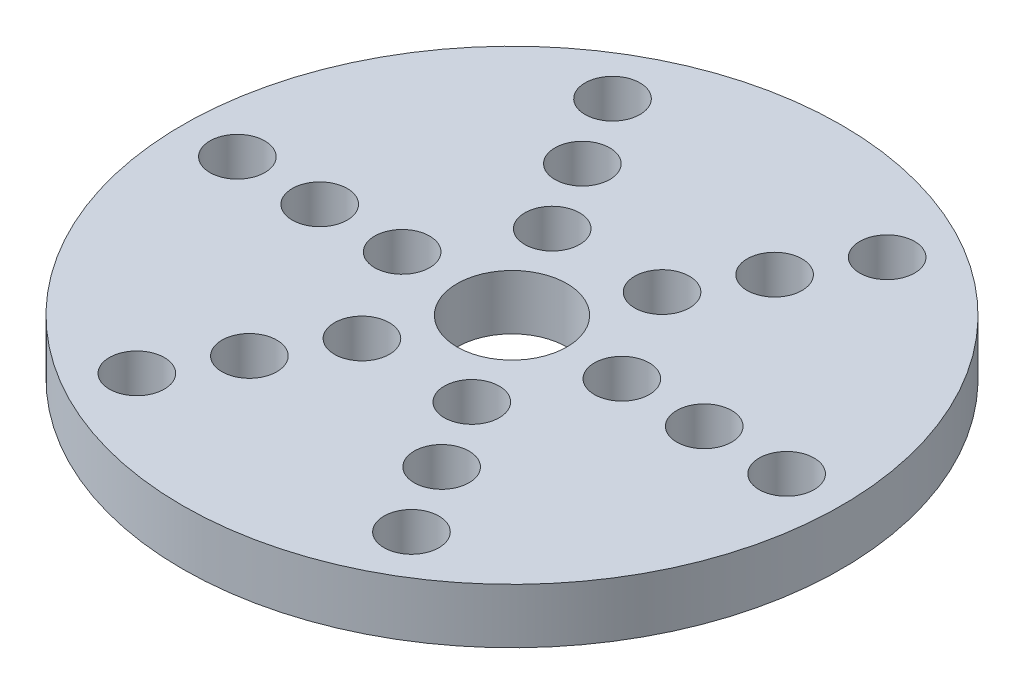
ISO-10303-21;
HEADER;
FILE_DESCRIPTION(('STEP AP214'),'2;1');
FILE_NAME('part.step','',(''),(''),'','','');
FILE_SCHEMA(('AUTOMOTIVE_DESIGN { 1 0 10303 214 1 1 1 1 }'));
ENDSEC;
DATA;
#1=APPLICATION_CONTEXT('core data for automotive mechanical design processes');
#2=APPLICATION_PROTOCOL_DEFINITION('international standard','automotive_design',2000,#1);
#3=PRODUCT_CONTEXT('',#1,'mechanical');
#4=PRODUCT('Part','Part','',(#3));
#5=PRODUCT_RELATED_PRODUCT_CATEGORY('part','',(#4));
#6=PRODUCT_DEFINITION_FORMATION('','',#4);
#7=PRODUCT_DEFINITION_CONTEXT('part definition',#1,'design');
#8=PRODUCT_DEFINITION('design','',#6,#7);
#9=PRODUCT_DEFINITION_SHAPE('','',#8);
#10=(LENGTH_UNIT() NAMED_UNIT(*) SI_UNIT(.MILLI.,.METRE.));
#11=(NAMED_UNIT(*) PLANE_ANGLE_UNIT() SI_UNIT($,.RADIAN.));
#12=(NAMED_UNIT(*) SI_UNIT($,.STERADIAN.) SOLID_ANGLE_UNIT());
#13=UNCERTAINTY_MEASURE_WITH_UNIT(LENGTH_MEASURE(1.E-05),#10,'distance_accuracy_value','');
#14=(GEOMETRIC_REPRESENTATION_CONTEXT(3) GLOBAL_UNCERTAINTY_ASSIGNED_CONTEXT((#13)) GLOBAL_UNIT_ASSIGNED_CONTEXT((#10,
#11,#12)) REPRESENTATION_CONTEXT('',''));
#15=CARTESIAN_POINT('',(0.,0.,0.));
#16=DIRECTION('',(0.,0.,1.));
#17=DIRECTION('',(1.,0.,0.));
#18=AXIS2_PLACEMENT_3D('',#15,#16,#17);
#19=CARTESIAN_POINT('',(0.,10.,0.));
#20=DIRECTION('',(0.,1.,0.));
#21=DIRECTION('',(0.,0.,1.));
#22=AXIS2_PLACEMENT_3D('',#19,#20,#21);
#23=PLANE('',#22);
#24=CARTESIAN_POINT('',(24.9999999999996,10.,43.3012701892222));
#25=DIRECTION('',(0.,1.,0.));
#26=DIRECTION('',(0.,0.,1.));
#27=AXIS2_PLACEMENT_3D('',#24,#25,#26);
#28=CIRCLE('',#27,5.);
#29=CARTESIAN_POINT('',(24.9999999999996,10.,48.3012701892222));
#30=VERTEX_POINT('',#29);
#31=EDGE_CURVE('E184',#30,#30,#28,.T.);
#32=ORIENTED_EDGE('',*,*,#31,.F.);
#33=EDGE_LOOP('',(#32));
#34=FACE_BOUND('',#33,.T.);
#35=CARTESIAN_POINT('',(25.0000000000002,10.,-43.3012701892218));
#36=DIRECTION('',(0.,1.,0.));
#37=DIRECTION('',(0.,0.,1.));
#38=AXIS2_PLACEMENT_3D('',#35,#36,#37);
#39=CIRCLE('',#38,5.);
#40=CARTESIAN_POINT('',(25.0000000000002,10.,-38.3012701892218));
#41=VERTEX_POINT('',#40);
#42=EDGE_CURVE('E168',#41,#41,#39,.T.);
#43=ORIENTED_EDGE('',*,*,#42,.F.);
#44=EDGE_LOOP('',(#43));
#45=FACE_BOUND('',#44,.T.);
#46=CARTESIAN_POINT('',(-17.5000000000004,10.,30.3108891324552));
#47=DIRECTION('',(0.,1.,0.));
#48=DIRECTION('',(0.,0.,1.));
#49=AXIS2_PLACEMENT_3D('',#46,#47,#48);
#50=CIRCLE('',#49,5.);
#51=CARTESIAN_POINT('',(-17.5000000000004,10.,35.3108891324552));
#52=VERTEX_POINT('',#51);
#53=EDGE_CURVE('E152',#52,#52,#50,.T.);
#54=ORIENTED_EDGE('',*,*,#53,.F.);
#55=EDGE_LOOP('',(#54));
#56=FACE_BOUND('',#55,.T.);
#57=CARTESIAN_POINT('',(35.,10.,2.44403693719019E-13));
#58=DIRECTION('',(0.,1.,0.));
#59=DIRECTION('',(0.,0.,1.));
#60=AXIS2_PLACEMENT_3D('',#57,#58,#59);
#61=CIRCLE('',#60,5.);
#62=CARTESIAN_POINT('',(35.,10.,5.00000000000025));
#63=VERTEX_POINT('',#62);
#64=EDGE_CURVE('E136',#63,#63,#61,.T.);
#65=ORIENTED_EDGE('',*,*,#64,.F.);
#66=EDGE_LOOP('',(#65));
#67=FACE_BOUND('',#66,.T.);
#68=CARTESIAN_POINT('',(-17.4999999999999,10.,-30.3108891324554));
#69=DIRECTION('',(0.,1.,0.));
#70=DIRECTION('',(0.,0.,1.));
#71=AXIS2_PLACEMENT_3D('',#68,#69,#70);
#72=CIRCLE('',#71,5.);
#73=CARTESIAN_POINT('',(-17.4999999999999,10.,-25.3108891324554));
#74=VERTEX_POINT('',#73);
#75=EDGE_CURVE('E120',#74,#74,#72,.T.);
#76=ORIENTED_EDGE('',*,*,#75,.F.);
#77=EDGE_LOOP('',(#76));
#78=FACE_BOUND('',#77,.T.);
#79=CARTESIAN_POINT('',(9.99999999999984,10.,17.3205080756889));
#80=DIRECTION('',(0.,1.,0.));
#81=DIRECTION('',(0.,0.,1.));
#82=AXIS2_PLACEMENT_3D('',#79,#80,#81);
#83=CIRCLE('',#82,5.);
#84=CARTESIAN_POINT('',(9.99999999999984,10.,22.3205080756889));
#85=VERTEX_POINT('',#84);
#86=EDGE_CURVE('E104',#85,#85,#83,.T.);
#87=ORIENTED_EDGE('',*,*,#86,.F.);
#88=EDGE_LOOP('',(#87));
#89=FACE_BOUND('',#88,.T.);
#90=CARTESIAN_POINT('',(10.0000000000001,10.,-17.3205080756887));
#91=DIRECTION('',(0.,1.,0.));
#92=DIRECTION('',(0.,0.,1.));
#93=AXIS2_PLACEMENT_3D('',#90,#91,#92);
#94=CIRCLE('',#93,5.);
#95=CARTESIAN_POINT('',(10.0000000000001,10.,-12.3205080756887));
#96=VERTEX_POINT('',#95);
#97=EDGE_CURVE('E88',#96,#96,#94,.T.);
#98=ORIENTED_EDGE('',*,*,#97,.F.);
#99=EDGE_LOOP('',(#98));
#100=FACE_BOUND('',#99,.T.);
#101=CARTESIAN_POINT('',(-50.,10.,0.));
#102=DIRECTION('',(0.,1.,0.));
#103=DIRECTION('',(0.,0.,1.));
#104=AXIS2_PLACEMENT_3D('',#101,#102,#103);
#105=CIRCLE('',#104,5.);
#106=CARTESIAN_POINT('',(-50.,10.,5.));
#107=VERTEX_POINT('',#106);
#108=EDGE_CURVE('E72',#107,#107,#105,.T.);
#109=ORIENTED_EDGE('',*,*,#108,.F.);
#110=EDGE_LOOP('',(#109));
#111=FACE_BOUND('',#110,.T.);
#112=CARTESIAN_POINT('',(-20.,10.,0.));
#113=DIRECTION('',(0.,1.,0.));
#114=DIRECTION('',(0.,0.,1.));
#115=AXIS2_PLACEMENT_3D('',#112,#113,#114);
#116=CIRCLE('',#115,5.);
#117=CARTESIAN_POINT('',(-20.,10.,5.));
#118=VERTEX_POINT('',#117);
#119=EDGE_CURVE('E56',#118,#118,#116,.T.);
#120=ORIENTED_EDGE('',*,*,#119,.F.);
#121=EDGE_LOOP('',(#120));
#122=FACE_BOUND('',#121,.T.);
#123=CARTESIAN_POINT('',(0.,10.,0.));
#124=DIRECTION('',(0.,1.,0.));
#125=DIRECTION('',(0.,0.,1.));
#126=AXIS2_PLACEMENT_3D('',#123,#124,#125);
#127=CIRCLE('',#126,60.);
#128=CARTESIAN_POINT('',(0.,10.,60.));
#129=VERTEX_POINT('',#128);
#130=EDGE_CURVE('E10',#129,#129,#127,.T.);
#131=ORIENTED_EDGE('',*,*,#130,.T.);
#132=EDGE_LOOP('',(#131));
#133=FACE_BOUND('',#132,.T.);
#134=CARTESIAN_POINT('',(0.,10.,0.));
#135=DIRECTION('',(0.,1.,0.));
#136=DIRECTION('',(0.,0.,1.));
#137=AXIS2_PLACEMENT_3D('',#134,#135,#136);
#138=CIRCLE('',#137,10.);
#139=CARTESIAN_POINT('',(0.,10.,10.));
#140=VERTEX_POINT('',#139);
#141=EDGE_CURVE('E50',#140,#140,#138,.T.);
#142=ORIENTED_EDGE('',*,*,#141,.F.);
#143=EDGE_LOOP('',(#142));
#144=FACE_BOUND('',#143,.T.);
#145=CARTESIAN_POINT('',(-35.,10.,0.));
#146=DIRECTION('',(0.,1.,0.));
#147=DIRECTION('',(0.,0.,1.));
#148=AXIS2_PLACEMENT_3D('',#145,#146,#147);
#149=CIRCLE('',#148,5.);
#150=CARTESIAN_POINT('',(-35.,10.,5.));
#151=VERTEX_POINT('',#150);
#152=EDGE_CURVE('E64',#151,#151,#149,.T.);
#153=ORIENTED_EDGE('',*,*,#152,.F.);
#154=EDGE_LOOP('',(#153));
#155=FACE_BOUND('',#154,.T.);
#156=CARTESIAN_POINT('',(-9.99999999999996,10.,-17.3205080756888));
#157=DIRECTION('',(0.,1.,0.));
#158=DIRECTION('',(0.,0.,1.));
#159=AXIS2_PLACEMENT_3D('',#156,#157,#158);
#160=CIRCLE('',#159,5.);
#161=CARTESIAN_POINT('',(-9.99999999999996,10.,-12.3205080756888));
#162=VERTEX_POINT('',#161);
#163=EDGE_CURVE('E80',#162,#162,#160,.T.);
#164=ORIENTED_EDGE('',*,*,#163,.F.);
#165=EDGE_LOOP('',(#164));
#166=FACE_BOUND('',#165,.T.);
#167=CARTESIAN_POINT('',(20.,10.,1.39659253553725E-13));
#168=DIRECTION('',(0.,1.,0.));
#169=DIRECTION('',(0.,0.,1.));
#170=AXIS2_PLACEMENT_3D('',#167,#168,#169);
#171=CIRCLE('',#170,5.);
#172=CARTESIAN_POINT('',(20.,10.,5.00000000000014));
#173=VERTEX_POINT('',#172);
#174=EDGE_CURVE('E96',#173,#173,#171,.T.);
#175=ORIENTED_EDGE('',*,*,#174,.F.);
#176=EDGE_LOOP('',(#175));
#177=FACE_BOUND('',#176,.T.);
#178=CARTESIAN_POINT('',(-10.0000000000002,10.,17.3205080756887));
#179=DIRECTION('',(0.,1.,0.));
#180=DIRECTION('',(0.,0.,1.));
#181=AXIS2_PLACEMENT_3D('',#178,#179,#180);
#182=CIRCLE('',#181,5.);
#183=CARTESIAN_POINT('',(-10.0000000000002,10.,22.3205080756887));
#184=VERTEX_POINT('',#183);
#185=EDGE_CURVE('E112',#184,#184,#182,.T.);
#186=ORIENTED_EDGE('',*,*,#185,.F.);
#187=EDGE_LOOP('',(#186));
#188=FACE_BOUND('',#187,.T.);
#189=CARTESIAN_POINT('',(17.5000000000001,10.,-30.3108891324553));
#190=DIRECTION('',(0.,1.,0.));
#191=DIRECTION('',(0.,0.,1.));
#192=AXIS2_PLACEMENT_3D('',#189,#190,#191);
#193=CIRCLE('',#192,5.);
#194=CARTESIAN_POINT('',(17.5000000000001,10.,-25.3108891324553));
#195=VERTEX_POINT('',#194);
#196=EDGE_CURVE('E128',#195,#195,#193,.T.);
#197=ORIENTED_EDGE('',*,*,#196,.F.);
#198=EDGE_LOOP('',(#197));
#199=FACE_BOUND('',#198,.T.);
#200=CARTESIAN_POINT('',(17.4999999999997,10.,30.3108891324555));
#201=DIRECTION('',(0.,1.,0.));
#202=DIRECTION('',(0.,0.,1.));
#203=AXIS2_PLACEMENT_3D('',#200,#201,#202);
#204=CIRCLE('',#203,5.);
#205=CARTESIAN_POINT('',(17.4999999999997,10.,35.3108891324555));
#206=VERTEX_POINT('',#205);
#207=EDGE_CURVE('E144',#206,#206,#204,.T.);
#208=ORIENTED_EDGE('',*,*,#207,.F.);
#209=EDGE_LOOP('',(#208));
#210=FACE_BOUND('',#209,.T.);
#211=CARTESIAN_POINT('',(-24.9999999999999,10.,-43.301270189222));
#212=DIRECTION('',(0.,1.,0.));
#213=DIRECTION('',(0.,0.,1.));
#214=AXIS2_PLACEMENT_3D('',#211,#212,#213);
#215=CIRCLE('',#214,5.);
#216=CARTESIAN_POINT('',(-24.9999999999999,10.,-38.301270189222));
#217=VERTEX_POINT('',#216);
#218=EDGE_CURVE('E160',#217,#217,#215,.T.);
#219=ORIENTED_EDGE('',*,*,#218,.F.);
#220=EDGE_LOOP('',(#219));
#221=FACE_BOUND('',#220,.T.);
#222=CARTESIAN_POINT('',(50.,10.,3.49148133884313E-13));
#223=DIRECTION('',(0.,1.,0.));
#224=DIRECTION('',(0.,0.,1.));
#225=AXIS2_PLACEMENT_3D('',#222,#223,#224);
#226=CIRCLE('',#225,4.99999999999999);
#227=CARTESIAN_POINT('',(50.,10.,5.00000000000034));
#228=VERTEX_POINT('',#227);
#229=EDGE_CURVE('E176',#228,#228,#226,.T.);
#230=ORIENTED_EDGE('',*,*,#229,.F.);
#231=EDGE_LOOP('',(#230));
#232=FACE_BOUND('',#231,.T.);
#233=CARTESIAN_POINT('',(-25.0000000000005,10.,43.3012701892216));
#234=DIRECTION('',(0.,1.,0.));
#235=DIRECTION('',(0.,0.,1.));
#236=AXIS2_PLACEMENT_3D('',#233,#234,#235);
#237=CIRCLE('',#236,5.);
#238=CARTESIAN_POINT('',(-25.0000000000005,10.,48.3012701892216));
#239=VERTEX_POINT('',#238);
#240=EDGE_CURVE('E192',#239,#239,#237,.T.);
#241=ORIENTED_EDGE('',*,*,#240,.F.);
#242=EDGE_LOOP('',(#241));
#243=FACE_BOUND('',#242,.T.);
#244=ADVANCED_FACE('F37',(#34,#45,#56,#67,#78,#89,#100,#111,#122,#133,#144,#155,#166,#177,#188,
#199,#210,#221,#232,#243),#23,.T.);
#245=CARTESIAN_POINT('',(0.,0.,0.));
#246=DIRECTION('',(0.,1.,0.));
#247=DIRECTION('',(0.,0.,1.));
#248=AXIS2_PLACEMENT_3D('',#245,#246,#247);
#249=PLANE('',#248);
#250=CARTESIAN_POINT('',(0.,0.,0.));
#251=DIRECTION('',(0.,1.,0.));
#252=DIRECTION('',(0.,0.,1.));
#253=AXIS2_PLACEMENT_3D('',#250,#251,#252);
#254=CIRCLE('',#253,60.);
#255=CARTESIAN_POINT('',(0.,0.,60.));
#256=VERTEX_POINT('',#255);
#257=EDGE_CURVE('E41',#256,#256,#254,.T.);
#258=ORIENTED_EDGE('',*,*,#257,.F.);
#259=EDGE_LOOP('',(#258));
#260=FACE_BOUND('',#259,.T.);
#261=CARTESIAN_POINT('',(0.,0.,0.));
#262=DIRECTION('',(0.,1.,0.));
#263=DIRECTION('',(0.,0.,1.));
#264=AXIS2_PLACEMENT_3D('',#261,#262,#263);
#265=CIRCLE('',#264,10.);
#266=CARTESIAN_POINT('',(0.,0.,10.));
#267=VERTEX_POINT('',#266);
#268=EDGE_CURVE('E52',#267,#267,#265,.T.);
#269=ORIENTED_EDGE('',*,*,#268,.T.);
#270=EDGE_LOOP('',(#269));
#271=FACE_BOUND('',#270,.T.);
#272=CARTESIAN_POINT('',(-20.,0.,0.));
#273=DIRECTION('',(0.,1.,0.));
#274=DIRECTION('',(0.,0.,1.));
#275=AXIS2_PLACEMENT_3D('',#272,#273,#274);
#276=CIRCLE('',#275,5.);
#277=CARTESIAN_POINT('',(-20.,0.,5.));
#278=VERTEX_POINT('',#277);
#279=EDGE_CURVE('E60',#278,#278,#276,.T.);
#280=ORIENTED_EDGE('',*,*,#279,.T.);
#281=EDGE_LOOP('',(#280));
#282=FACE_BOUND('',#281,.T.);
#283=CARTESIAN_POINT('',(-35.,0.,0.));
#284=DIRECTION('',(0.,1.,0.));
#285=DIRECTION('',(0.,0.,1.));
#286=AXIS2_PLACEMENT_3D('',#283,#284,#285);
#287=CIRCLE('',#286,5.);
#288=CARTESIAN_POINT('',(-35.,0.,5.));
#289=VERTEX_POINT('',#288);
#290=EDGE_CURVE('E68',#289,#289,#287,.T.);
#291=ORIENTED_EDGE('',*,*,#290,.T.);
#292=EDGE_LOOP('',(#291));
#293=FACE_BOUND('',#292,.T.);
#294=CARTESIAN_POINT('',(-50.,0.,0.));
#295=DIRECTION('',(0.,1.,0.));
#296=DIRECTION('',(0.,0.,1.));
#297=AXIS2_PLACEMENT_3D('',#294,#295,#296);
#298=CIRCLE('',#297,5.);
#299=CARTESIAN_POINT('',(-50.,0.,5.));
#300=VERTEX_POINT('',#299);
#301=EDGE_CURVE('E76',#300,#300,#298,.T.);
#302=ORIENTED_EDGE('',*,*,#301,.T.);
#303=EDGE_LOOP('',(#302));
#304=FACE_BOUND('',#303,.T.);
#305=CARTESIAN_POINT('',(-9.99999999999996,0.,-17.3205080756888));
#306=DIRECTION('',(0.,1.,0.));
#307=DIRECTION('',(0.,0.,1.));
#308=AXIS2_PLACEMENT_3D('',#305,#306,#307);
#309=CIRCLE('',#308,5.);
#310=CARTESIAN_POINT('',(-9.99999999999996,0.,-12.3205080756888));
#311=VERTEX_POINT('',#310);
#312=EDGE_CURVE('E84',#311,#311,#309,.T.);
#313=ORIENTED_EDGE('',*,*,#312,.T.);
#314=EDGE_LOOP('',(#313));
#315=FACE_BOUND('',#314,.T.);
#316=CARTESIAN_POINT('',(10.0000000000001,0.,-17.3205080756887));
#317=DIRECTION('',(0.,1.,0.));
#318=DIRECTION('',(0.,0.,1.));
#319=AXIS2_PLACEMENT_3D('',#316,#317,#318);
#320=CIRCLE('',#319,5.);
#321=CARTESIAN_POINT('',(10.0000000000001,0.,-12.3205080756887));
#322=VERTEX_POINT('',#321);
#323=EDGE_CURVE('E92',#322,#322,#320,.T.);
#324=ORIENTED_EDGE('',*,*,#323,.T.);
#325=EDGE_LOOP('',(#324));
#326=FACE_BOUND('',#325,.T.);
#327=CARTESIAN_POINT('',(20.,0.,1.39659253553725E-13));
#328=DIRECTION('',(0.,1.,0.));
#329=DIRECTION('',(0.,0.,1.));
#330=AXIS2_PLACEMENT_3D('',#327,#328,#329);
#331=CIRCLE('',#330,5.);
#332=CARTESIAN_POINT('',(20.,0.,5.00000000000014));
#333=VERTEX_POINT('',#332);
#334=EDGE_CURVE('E100',#333,#333,#331,.T.);
#335=ORIENTED_EDGE('',*,*,#334,.T.);
#336=EDGE_LOOP('',(#335));
#337=FACE_BOUND('',#336,.T.);
#338=CARTESIAN_POINT('',(9.99999999999984,0.,17.3205080756889));
#339=DIRECTION('',(0.,1.,0.));
#340=DIRECTION('',(0.,0.,1.));
#341=AXIS2_PLACEMENT_3D('',#338,#339,#340);
#342=CIRCLE('',#341,5.);
#343=CARTESIAN_POINT('',(9.99999999999984,0.,22.3205080756889));
#344=VERTEX_POINT('',#343);
#345=EDGE_CURVE('E108',#344,#344,#342,.T.);
#346=ORIENTED_EDGE('',*,*,#345,.T.);
#347=EDGE_LOOP('',(#346));
#348=FACE_BOUND('',#347,.T.);
#349=CARTESIAN_POINT('',(-10.0000000000002,0.,17.3205080756887));
#350=DIRECTION('',(0.,1.,0.));
#351=DIRECTION('',(0.,0.,1.));
#352=AXIS2_PLACEMENT_3D('',#349,#350,#351);
#353=CIRCLE('',#352,5.);
#354=CARTESIAN_POINT('',(-10.0000000000002,0.,22.3205080756887));
#355=VERTEX_POINT('',#354);
#356=EDGE_CURVE('E116',#355,#355,#353,.T.);
#357=ORIENTED_EDGE('',*,*,#356,.T.);
#358=EDGE_LOOP('',(#357));
#359=FACE_BOUND('',#358,.T.);
#360=CARTESIAN_POINT('',(-17.4999999999999,0.,-30.3108891324554));
#361=DIRECTION('',(0.,1.,0.));
#362=DIRECTION('',(0.,0.,1.));
#363=AXIS2_PLACEMENT_3D('',#360,#361,#362);
#364=CIRCLE('',#363,5.);
#365=CARTESIAN_POINT('',(-17.4999999999999,0.,-25.3108891324554));
#366=VERTEX_POINT('',#365);
#367=EDGE_CURVE('E124',#366,#366,#364,.T.);
#368=ORIENTED_EDGE('',*,*,#367,.T.);
#369=EDGE_LOOP('',(#368));
#370=FACE_BOUND('',#369,.T.);
#371=CARTESIAN_POINT('',(17.5000000000001,0.,-30.3108891324553));
#372=DIRECTION('',(0.,1.,0.));
#373=DIRECTION('',(0.,0.,1.));
#374=AXIS2_PLACEMENT_3D('',#371,#372,#373);
#375=CIRCLE('',#374,5.);
#376=CARTESIAN_POINT('',(17.5000000000001,0.,-25.3108891324553));
#377=VERTEX_POINT('',#376);
#378=EDGE_CURVE('E132',#377,#377,#375,.T.);
#379=ORIENTED_EDGE('',*,*,#378,.T.);
#380=EDGE_LOOP('',(#379));
#381=FACE_BOUND('',#380,.T.);
#382=CARTESIAN_POINT('',(35.,0.,2.44403693719019E-13));
#383=DIRECTION('',(0.,1.,0.));
#384=DIRECTION('',(0.,0.,1.));
#385=AXIS2_PLACEMENT_3D('',#382,#383,#384);
#386=CIRCLE('',#385,5.);
#387=CARTESIAN_POINT('',(35.,0.,5.00000000000025));
#388=VERTEX_POINT('',#387);
#389=EDGE_CURVE('E140',#388,#388,#386,.T.);
#390=ORIENTED_EDGE('',*,*,#389,.T.);
#391=EDGE_LOOP('',(#390));
#392=FACE_BOUND('',#391,.T.);
#393=CARTESIAN_POINT('',(17.4999999999997,0.,30.3108891324555));
#394=DIRECTION('',(0.,1.,0.));
#395=DIRECTION('',(0.,0.,1.));
#396=AXIS2_PLACEMENT_3D('',#393,#394,#395);
#397=CIRCLE('',#396,5.);
#398=CARTESIAN_POINT('',(17.4999999999997,0.,35.3108891324555));
#399=VERTEX_POINT('',#398);
#400=EDGE_CURVE('E148',#399,#399,#397,.T.);
#401=ORIENTED_EDGE('',*,*,#400,.T.);
#402=EDGE_LOOP('',(#401));
#403=FACE_BOUND('',#402,.T.);
#404=CARTESIAN_POINT('',(-17.5000000000004,0.,30.3108891324552));
#405=DIRECTION('',(0.,1.,0.));
#406=DIRECTION('',(0.,0.,1.));
#407=AXIS2_PLACEMENT_3D('',#404,#405,#406);
#408=CIRCLE('',#407,5.);
#409=CARTESIAN_POINT('',(-17.5000000000004,0.,35.3108891324552));
#410=VERTEX_POINT('',#409);
#411=EDGE_CURVE('E156',#410,#410,#408,.T.);
#412=ORIENTED_EDGE('',*,*,#411,.T.);
#413=EDGE_LOOP('',(#412));
#414=FACE_BOUND('',#413,.T.);
#415=CARTESIAN_POINT('',(-24.9999999999999,0.,-43.301270189222));
#416=DIRECTION('',(0.,1.,0.));
#417=DIRECTION('',(0.,0.,1.));
#418=AXIS2_PLACEMENT_3D('',#415,#416,#417);
#419=CIRCLE('',#418,5.);
#420=CARTESIAN_POINT('',(-24.9999999999999,0.,-38.301270189222));
#421=VERTEX_POINT('',#420);
#422=EDGE_CURVE('E164',#421,#421,#419,.T.);
#423=ORIENTED_EDGE('',*,*,#422,.T.);
#424=EDGE_LOOP('',(#423));
#425=FACE_BOUND('',#424,.T.);
#426=CARTESIAN_POINT('',(25.0000000000002,0.,-43.3012701892218));
#427=DIRECTION('',(0.,1.,0.));
#428=DIRECTION('',(0.,0.,1.));
#429=AXIS2_PLACEMENT_3D('',#426,#427,#428);
#430=CIRCLE('',#429,5.);
#431=CARTESIAN_POINT('',(25.0000000000002,0.,-38.3012701892218));
#432=VERTEX_POINT('',#431);
#433=EDGE_CURVE('E172',#432,#432,#430,.T.);
#434=ORIENTED_EDGE('',*,*,#433,.T.);
#435=EDGE_LOOP('',(#434));
#436=FACE_BOUND('',#435,.T.);
#437=CARTESIAN_POINT('',(50.,0.,3.49148133884313E-13));
#438=DIRECTION('',(0.,1.,0.));
#439=DIRECTION('',(0.,0.,1.));
#440=AXIS2_PLACEMENT_3D('',#437,#438,#439);
#441=CIRCLE('',#440,4.99999999999999);
#442=CARTESIAN_POINT('',(50.,0.,5.00000000000034));
#443=VERTEX_POINT('',#442);
#444=EDGE_CURVE('E180',#443,#443,#441,.T.);
#445=ORIENTED_EDGE('',*,*,#444,.T.);
#446=EDGE_LOOP('',(#445));
#447=FACE_BOUND('',#446,.T.);
#448=CARTESIAN_POINT('',(24.9999999999996,0.,43.3012701892222));
#449=DIRECTION('',(0.,1.,0.));
#450=DIRECTION('',(0.,0.,1.));
#451=AXIS2_PLACEMENT_3D('',#448,#449,#450);
#452=CIRCLE('',#451,5.);
#453=CARTESIAN_POINT('',(24.9999999999996,0.,48.3012701892222));
#454=VERTEX_POINT('',#453);
#455=EDGE_CURVE('E188',#454,#454,#452,.T.);
#456=ORIENTED_EDGE('',*,*,#455,.T.);
#457=EDGE_LOOP('',(#456));
#458=FACE_BOUND('',#457,.T.);
#459=CARTESIAN_POINT('',(-25.0000000000005,0.,43.3012701892216));
#460=DIRECTION('',(0.,1.,0.));
#461=DIRECTION('',(0.,0.,1.));
#462=AXIS2_PLACEMENT_3D('',#459,#460,#461);
#463=CIRCLE('',#462,5.);
#464=CARTESIAN_POINT('',(-25.0000000000005,0.,48.3012701892216));
#465=VERTEX_POINT('',#464);
#466=EDGE_CURVE('E196',#465,#465,#463,.T.);
#467=ORIENTED_EDGE('',*,*,#466,.T.);
#468=EDGE_LOOP('',(#467));
#469=FACE_BOUND('',#468,.T.);
#470=ADVANCED_FACE('F208',(#260,#271,#282,#293,#304,#315,#326,#337,#348,#359,#370,#381,#392,
#403,#414,#425,#436,#447,#458,#469),#249,.F.);
#471=CARTESIAN_POINT('',(0.,10.,0.));
#472=DIRECTION('',(0.,-1.,0.));
#473=DIRECTION('',(0.,0.,-1.));
#474=AXIS2_PLACEMENT_3D('',#471,#472,#473);
#475=CYLINDRICAL_SURFACE('',#474,60.);
#476=ORIENTED_EDGE('',*,*,#130,.F.);
#477=EDGE_LOOP('',(#476));
#478=FACE_BOUND('',#477,.T.);
#479=ORIENTED_EDGE('',*,*,#257,.T.);
#480=EDGE_LOOP('',(#479));
#481=FACE_BOUND('',#480,.T.);
#482=ADVANCED_FACE('F39',(#478,#481),#475,.T.);
#483=CARTESIAN_POINT('',(0.,10.,0.));
#484=DIRECTION('',(0.,-1.,0.));
#485=DIRECTION('',(0.,0.,-1.));
#486=AXIS2_PLACEMENT_3D('',#483,#484,#485);
#487=CYLINDRICAL_SURFACE('',#486,10.);
#488=ORIENTED_EDGE('',*,*,#141,.T.);
#489=EDGE_LOOP('',(#488));
#490=FACE_BOUND('',#489,.T.);
#491=ORIENTED_EDGE('',*,*,#268,.F.);
#492=EDGE_LOOP('',(#491));
#493=FACE_BOUND('',#492,.T.);
#494=ADVANCED_FACE('F218',(#490,#493),#487,.F.);
#495=CARTESIAN_POINT('',(-20.,10.,0.));
#496=DIRECTION('',(0.,-1.,0.));
#497=DIRECTION('',(0.,0.,-1.));
#498=AXIS2_PLACEMENT_3D('',#495,#496,#497);
#499=CYLINDRICAL_SURFACE('',#498,5.);
#500=ORIENTED_EDGE('',*,*,#119,.T.);
#501=EDGE_LOOP('',(#500));
#502=FACE_BOUND('',#501,.T.);
#503=ORIENTED_EDGE('',*,*,#279,.F.);
#504=EDGE_LOOP('',(#503));
#505=FACE_BOUND('',#504,.T.);
#506=ADVANCED_FACE('F221',(#502,#505),#499,.F.);
#507=CARTESIAN_POINT('',(-35.,10.,0.));
#508=DIRECTION('',(0.,-1.,0.));
#509=DIRECTION('',(0.,0.,-1.));
#510=AXIS2_PLACEMENT_3D('',#507,#508,#509);
#511=CYLINDRICAL_SURFACE('',#510,5.);
#512=ORIENTED_EDGE('',*,*,#152,.T.);
#513=EDGE_LOOP('',(#512));
#514=FACE_BOUND('',#513,.T.);
#515=ORIENTED_EDGE('',*,*,#290,.F.);
#516=EDGE_LOOP('',(#515));
#517=FACE_BOUND('',#516,.T.);
#518=ADVANCED_FACE('F225',(#514,#517),#511,.F.);
#519=CARTESIAN_POINT('',(-50.,10.,0.));
#520=DIRECTION('',(0.,-1.,0.));
#521=DIRECTION('',(0.,0.,-1.));
#522=AXIS2_PLACEMENT_3D('',#519,#520,#521);
#523=CYLINDRICAL_SURFACE('',#522,5.);
#524=ORIENTED_EDGE('',*,*,#108,.T.);
#525=EDGE_LOOP('',(#524));
#526=FACE_BOUND('',#525,.T.);
#527=ORIENTED_EDGE('',*,*,#301,.F.);
#528=EDGE_LOOP('',(#527));
#529=FACE_BOUND('',#528,.T.);
#530=ADVANCED_FACE('F229',(#526,#529),#523,.F.);
#531=CARTESIAN_POINT('',(-9.99999999999996,10.,-17.3205080756888));
#532=DIRECTION('',(0.,-1.,0.));
#533=DIRECTION('',(0.,0.,-1.));
#534=AXIS2_PLACEMENT_3D('',#531,#532,#533);
#535=CYLINDRICAL_SURFACE('',#534,5.);
#536=ORIENTED_EDGE('',*,*,#163,.T.);
#537=EDGE_LOOP('',(#536));
#538=FACE_BOUND('',#537,.T.);
#539=ORIENTED_EDGE('',*,*,#312,.F.);
#540=EDGE_LOOP('',(#539));
#541=FACE_BOUND('',#540,.T.);
#542=ADVANCED_FACE('F233',(#538,#541),#535,.F.);
#543=CARTESIAN_POINT('',(10.0000000000001,10.,-17.3205080756887));
#544=DIRECTION('',(0.,-1.,0.));
#545=DIRECTION('',(0.,0.,-1.));
#546=AXIS2_PLACEMENT_3D('',#543,#544,#545);
#547=CYLINDRICAL_SURFACE('',#546,5.);
#548=ORIENTED_EDGE('',*,*,#97,.T.);
#549=EDGE_LOOP('',(#548));
#550=FACE_BOUND('',#549,.T.);
#551=ORIENTED_EDGE('',*,*,#323,.F.);
#552=EDGE_LOOP('',(#551));
#553=FACE_BOUND('',#552,.T.);
#554=ADVANCED_FACE('F237',(#550,#553),#547,.F.);
#555=CARTESIAN_POINT('',(20.,10.,1.39659253553725E-13));
#556=DIRECTION('',(0.,-1.,0.));
#557=DIRECTION('',(0.,0.,-1.));
#558=AXIS2_PLACEMENT_3D('',#555,#556,#557);
#559=CYLINDRICAL_SURFACE('',#558,5.);
#560=ORIENTED_EDGE('',*,*,#174,.T.);
#561=EDGE_LOOP('',(#560));
#562=FACE_BOUND('',#561,.T.);
#563=ORIENTED_EDGE('',*,*,#334,.F.);
#564=EDGE_LOOP('',(#563));
#565=FACE_BOUND('',#564,.T.);
#566=ADVANCED_FACE('F241',(#562,#565),#559,.F.);
#567=CARTESIAN_POINT('',(9.99999999999984,10.,17.3205080756889));
#568=DIRECTION('',(0.,-1.,0.));
#569=DIRECTION('',(0.,0.,-1.));
#570=AXIS2_PLACEMENT_3D('',#567,#568,#569);
#571=CYLINDRICAL_SURFACE('',#570,5.);
#572=ORIENTED_EDGE('',*,*,#86,.T.);
#573=EDGE_LOOP('',(#572));
#574=FACE_BOUND('',#573,.T.);
#575=ORIENTED_EDGE('',*,*,#345,.F.);
#576=EDGE_LOOP('',(#575));
#577=FACE_BOUND('',#576,.T.);
#578=ADVANCED_FACE('F245',(#574,#577),#571,.F.);
#579=CARTESIAN_POINT('',(-10.0000000000002,10.,17.3205080756887));
#580=DIRECTION('',(0.,-1.,0.));
#581=DIRECTION('',(0.,0.,-1.));
#582=AXIS2_PLACEMENT_3D('',#579,#580,#581);
#583=CYLINDRICAL_SURFACE('',#582,5.);
#584=ORIENTED_EDGE('',*,*,#185,.T.);
#585=EDGE_LOOP('',(#584));
#586=FACE_BOUND('',#585,.T.);
#587=ORIENTED_EDGE('',*,*,#356,.F.);
#588=EDGE_LOOP('',(#587));
#589=FACE_BOUND('',#588,.T.);
#590=ADVANCED_FACE('F249',(#586,#589),#583,.F.);
#591=CARTESIAN_POINT('',(-17.4999999999999,10.,-30.3108891324554));
#592=DIRECTION('',(0.,-1.,0.));
#593=DIRECTION('',(0.,0.,-1.));
#594=AXIS2_PLACEMENT_3D('',#591,#592,#593);
#595=CYLINDRICAL_SURFACE('',#594,5.);
#596=ORIENTED_EDGE('',*,*,#75,.T.);
#597=EDGE_LOOP('',(#596));
#598=FACE_BOUND('',#597,.T.);
#599=ORIENTED_EDGE('',*,*,#367,.F.);
#600=EDGE_LOOP('',(#599));
#601=FACE_BOUND('',#600,.T.);
#602=ADVANCED_FACE('F253',(#598,#601),#595,.F.);
#603=CARTESIAN_POINT('',(17.5000000000001,10.,-30.3108891324553));
#604=DIRECTION('',(0.,-1.,0.));
#605=DIRECTION('',(0.,0.,-1.));
#606=AXIS2_PLACEMENT_3D('',#603,#604,#605);
#607=CYLINDRICAL_SURFACE('',#606,5.);
#608=ORIENTED_EDGE('',*,*,#196,.T.);
#609=EDGE_LOOP('',(#608));
#610=FACE_BOUND('',#609,.T.);
#611=ORIENTED_EDGE('',*,*,#378,.F.);
#612=EDGE_LOOP('',(#611));
#613=FACE_BOUND('',#612,.T.);
#614=ADVANCED_FACE('F257',(#610,#613),#607,.F.);
#615=CARTESIAN_POINT('',(35.,10.,2.44403693719019E-13));
#616=DIRECTION('',(0.,-1.,0.));
#617=DIRECTION('',(0.,0.,-1.));
#618=AXIS2_PLACEMENT_3D('',#615,#616,#617);
#619=CYLINDRICAL_SURFACE('',#618,5.);
#620=ORIENTED_EDGE('',*,*,#64,.T.);
#621=EDGE_LOOP('',(#620));
#622=FACE_BOUND('',#621,.T.);
#623=ORIENTED_EDGE('',*,*,#389,.F.);
#624=EDGE_LOOP('',(#623));
#625=FACE_BOUND('',#624,.T.);
#626=ADVANCED_FACE('F261',(#622,#625),#619,.F.);
#627=CARTESIAN_POINT('',(17.4999999999997,10.,30.3108891324555));
#628=DIRECTION('',(0.,-1.,0.));
#629=DIRECTION('',(0.,0.,-1.));
#630=AXIS2_PLACEMENT_3D('',#627,#628,#629);
#631=CYLINDRICAL_SURFACE('',#630,5.);
#632=ORIENTED_EDGE('',*,*,#207,.T.);
#633=EDGE_LOOP('',(#632));
#634=FACE_BOUND('',#633,.T.);
#635=ORIENTED_EDGE('',*,*,#400,.F.);
#636=EDGE_LOOP('',(#635));
#637=FACE_BOUND('',#636,.T.);
#638=ADVANCED_FACE('F265',(#634,#637),#631,.F.);
#639=CARTESIAN_POINT('',(-17.5000000000004,10.,30.3108891324552));
#640=DIRECTION('',(0.,-1.,0.));
#641=DIRECTION('',(0.,0.,-1.));
#642=AXIS2_PLACEMENT_3D('',#639,#640,#641);
#643=CYLINDRICAL_SURFACE('',#642,5.);
#644=ORIENTED_EDGE('',*,*,#53,.T.);
#645=EDGE_LOOP('',(#644));
#646=FACE_BOUND('',#645,.T.);
#647=ORIENTED_EDGE('',*,*,#411,.F.);
#648=EDGE_LOOP('',(#647));
#649=FACE_BOUND('',#648,.T.);
#650=ADVANCED_FACE('F269',(#646,#649),#643,.F.);
#651=CARTESIAN_POINT('',(-24.9999999999999,10.,-43.301270189222));
#652=DIRECTION('',(0.,-1.,0.));
#653=DIRECTION('',(0.,0.,-1.));
#654=AXIS2_PLACEMENT_3D('',#651,#652,#653);
#655=CYLINDRICAL_SURFACE('',#654,5.);
#656=ORIENTED_EDGE('',*,*,#218,.T.);
#657=EDGE_LOOP('',(#656));
#658=FACE_BOUND('',#657,.T.);
#659=ORIENTED_EDGE('',*,*,#422,.F.);
#660=EDGE_LOOP('',(#659));
#661=FACE_BOUND('',#660,.T.);
#662=ADVANCED_FACE('F273',(#658,#661),#655,.F.);
#663=CARTESIAN_POINT('',(25.0000000000002,10.,-43.3012701892218));
#664=DIRECTION('',(0.,-1.,0.));
#665=DIRECTION('',(0.,0.,-1.));
#666=AXIS2_PLACEMENT_3D('',#663,#664,#665);
#667=CYLINDRICAL_SURFACE('',#666,5.);
#668=ORIENTED_EDGE('',*,*,#42,.T.);
#669=EDGE_LOOP('',(#668));
#670=FACE_BOUND('',#669,.T.);
#671=ORIENTED_EDGE('',*,*,#433,.F.);
#672=EDGE_LOOP('',(#671));
#673=FACE_BOUND('',#672,.T.);
#674=ADVANCED_FACE('F277',(#670,#673),#667,.F.);
#675=CARTESIAN_POINT('',(50.,10.,3.49148133884313E-13));
#676=DIRECTION('',(0.,-1.,0.));
#677=DIRECTION('',(0.,0.,-1.));
#678=AXIS2_PLACEMENT_3D('',#675,#676,#677);
#679=CYLINDRICAL_SURFACE('',#678,4.99999999999999);
#680=ORIENTED_EDGE('',*,*,#229,.T.);
#681=EDGE_LOOP('',(#680));
#682=FACE_BOUND('',#681,.T.);
#683=ORIENTED_EDGE('',*,*,#444,.F.);
#684=EDGE_LOOP('',(#683));
#685=FACE_BOUND('',#684,.T.);
#686=ADVANCED_FACE('F281',(#682,#685),#679,.F.);
#687=CARTESIAN_POINT('',(24.9999999999996,10.,43.3012701892222));
#688=DIRECTION('',(0.,-1.,0.));
#689=DIRECTION('',(0.,0.,-1.));
#690=AXIS2_PLACEMENT_3D('',#687,#688,#689);
#691=CYLINDRICAL_SURFACE('',#690,5.);
#692=ORIENTED_EDGE('',*,*,#31,.T.);
#693=EDGE_LOOP('',(#692));
#694=FACE_BOUND('',#693,.T.);
#695=ORIENTED_EDGE('',*,*,#455,.F.);
#696=EDGE_LOOP('',(#695));
#697=FACE_BOUND('',#696,.T.);
#698=ADVANCED_FACE('F285',(#694,#697),#691,.F.);
#699=CARTESIAN_POINT('',(-25.0000000000005,10.,43.3012701892216));
#700=DIRECTION('',(0.,-1.,0.));
#701=DIRECTION('',(0.,0.,-1.));
#702=AXIS2_PLACEMENT_3D('',#699,#700,#701);
#703=CYLINDRICAL_SURFACE('',#702,5.);
#704=ORIENTED_EDGE('',*,*,#240,.T.);
#705=EDGE_LOOP('',(#704));
#706=FACE_BOUND('',#705,.T.);
#707=ORIENTED_EDGE('',*,*,#466,.F.);
#708=EDGE_LOOP('',(#707));
#709=FACE_BOUND('',#708,.T.);
#710=ADVANCED_FACE('F204',(#706,#709),#703,.F.);
#711=CLOSED_SHELL('',(#244,#470,#482,#494,#506,#518,#530,#542,#554,#566,#578,#590,#602,#614,
#626,#638,#650,#662,#674,#686,#698,#710));
#712=MANIFOLD_SOLID_BREP('B2',#711);
#713=ADVANCED_BREP_SHAPE_REPRESENTATION('',(#18,#712),#14);
#714=SHAPE_DEFINITION_REPRESENTATION(#9,#713);
ENDSEC;
END-ISO-10303-21;
